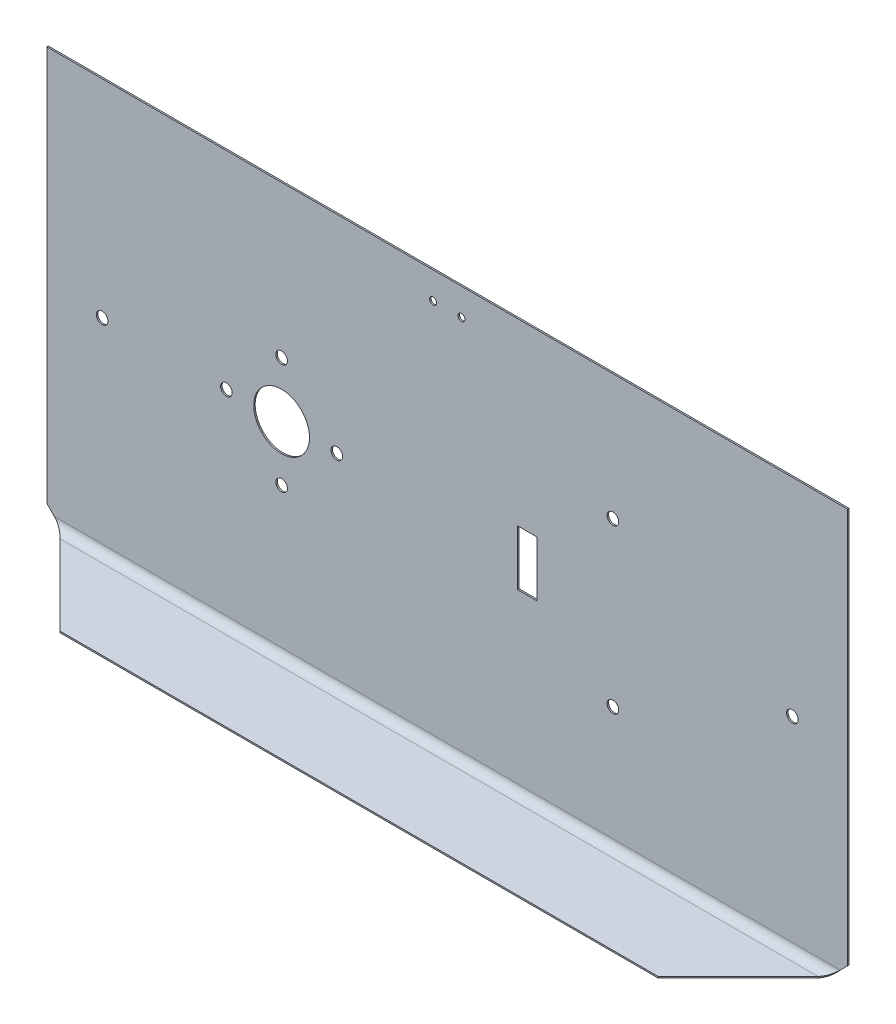
ISO-10303-21;
HEADER;
FILE_DESCRIPTION(('STEP AP214'),'2;1');
FILE_NAME('part.step','',(''),(''),'','','');
FILE_SCHEMA(('AUTOMOTIVE_DESIGN { 1 0 10303 214 1 1 1 1 }'));
ENDSEC;
DATA;
#1=APPLICATION_CONTEXT('core data for automotive mechanical design processes');
#2=APPLICATION_PROTOCOL_DEFINITION('international standard','automotive_design',2000,#1);
#3=PRODUCT_CONTEXT('',#1,'mechanical');
#4=PRODUCT('Part','Part','',(#3));
#5=PRODUCT_RELATED_PRODUCT_CATEGORY('part','',(#4));
#6=PRODUCT_DEFINITION_FORMATION('','',#4);
#7=PRODUCT_DEFINITION_CONTEXT('part definition',#1,'design');
#8=PRODUCT_DEFINITION('design','',#6,#7);
#9=PRODUCT_DEFINITION_SHAPE('','',#8);
#10=(LENGTH_UNIT() NAMED_UNIT(*) SI_UNIT(.MILLI.,.METRE.));
#11=(NAMED_UNIT(*) PLANE_ANGLE_UNIT() SI_UNIT($,.RADIAN.));
#12=(NAMED_UNIT(*) SI_UNIT($,.STERADIAN.) SOLID_ANGLE_UNIT());
#13=UNCERTAINTY_MEASURE_WITH_UNIT(LENGTH_MEASURE(1.E-05),#10,'distance_accuracy_value','');
#14=(GEOMETRIC_REPRESENTATION_CONTEXT(3) GLOBAL_UNCERTAINTY_ASSIGNED_CONTEXT((#13)) GLOBAL_UNIT_ASSIGNED_CONTEXT((#10,
#11,#12)) REPRESENTATION_CONTEXT('',''));
#15=CARTESIAN_POINT('',(0.,0.,0.));
#16=DIRECTION('',(0.,0.,1.));
#17=DIRECTION('',(1.,0.,0.));
#18=AXIS2_PLACEMENT_3D('',#15,#16,#17);
#19=CARTESIAN_POINT('',(145.,-58.9352822974256,-4.28615324153258));
#20=DIRECTION('',(0.707106781186539,0.,0.707106781186556));
#21=DIRECTION('',(0.707106781186556,0.,-0.707106781186539));
#22=AXIS2_PLACEMENT_3D('',#19,#20,#21);
#23=PLANE('',#22);
#24=DIRECTION('',(0.707106781186556,0.,-0.707106781186539));
#25=VECTOR('',#24,1.);
#26=CARTESIAN_POINT('',(145.,-59.4662822974256,-4.28615324153258));
#27=LINE('',#26,#25);
#28=CARTESIAN_POINT('',(108.247564461041,-59.4662822974255,32.4662822974255));
#29=VERTEX_POINT('',#28);
#30=CARTESIAN_POINT('',(137.182846758467,-59.4662822974256,3.53100000000001));
#31=VERTEX_POINT('',#30);
#32=EDGE_CURVE('E488',#29,#31,#27,.T.);
#33=ORIENTED_EDGE('',*,*,#32,.T.);
#34=CARTESIAN_POINT('',(137.182846758467,-58.9352822974256,3.53100000000001));
#35=CARTESIAN_POINT('',(137.182846758467,-59.4662822974256,3.53100000000001));
#36=B_SPLINE_CURVE_WITH_KNOTS('',1,(#34,#35),.UNSPECIFIED.,.F.,.F.,(2,2),(0.,1.),.UNSPECIFIED.);
#37=CARTESIAN_POINT('',(137.182846758467,-58.9352822974256,3.53100000000001));
#38=VERTEX_POINT('',#37);
#39=EDGE_CURVE('E501',#31,#38,#36,.F.);
#40=ORIENTED_EDGE('',*,*,#39,.T.);
#41=DIRECTION('',(0.707106781186556,0.,-0.707106781186539));
#42=VECTOR('',#41,1.);
#43=CARTESIAN_POINT('',(145.,-58.9352822974256,-4.28615324153258));
#44=LINE('',#43,#42);
#45=CARTESIAN_POINT('',(108.247564461041,-58.9352822974255,32.4662822974255));
#46=VERTEX_POINT('',#45);
#47=EDGE_CURVE('E482',#46,#38,#44,.T.);
#48=ORIENTED_EDGE('',*,*,#47,.F.);
#49=DIRECTION('',(0.,1.,0.));
#50=VECTOR('',#49,1.);
#51=CARTESIAN_POINT('',(108.247564461041,-58.9352822974255,32.4662822974255));
#52=LINE('',#51,#50);
#53=EDGE_CURVE('E490',#29,#46,#52,.T.);
#54=ORIENTED_EDGE('',*,*,#53,.F.);
#55=EDGE_LOOP('',(#33,#40,#48,#54));
#56=FACE_BOUND('',#55,.T.);
#57=ADVANCED_FACE('F66',(#56),#23,.T.);
#58=CARTESIAN_POINT('',(-145.,-58.9352822974256,-4.28615324153243));
#59=DIRECTION('',(-0.707106781186537,0.,0.707106781186558));
#60=DIRECTION('',(0.707106781186558,0.,0.707106781186537));
#61=AXIS2_PLACEMENT_3D('',#58,#59,#60);
#62=PLANE('',#61);
#63=DIRECTION('',(0.707106781186558,0.,0.707106781186537));
#64=VECTOR('',#63,1.);
#65=CARTESIAN_POINT('',(-145.,-58.9352822974256,-4.28615324153243));
#66=LINE('',#65,#64);
#67=CARTESIAN_POINT('',(-137.182846758467,-58.9352822974256,3.53100000000002));
#68=VERTEX_POINT('',#67);
#69=CARTESIAN_POINT('',(-108.247564461041,-58.9352822974255,32.4662822974256));
#70=VERTEX_POINT('',#69);
#71=EDGE_CURVE('E483',#68,#70,#66,.T.);
#72=ORIENTED_EDGE('',*,*,#71,.F.);
#73=CARTESIAN_POINT('',(-137.182846758467,-59.4662822974256,3.53100000000001));
#74=CARTESIAN_POINT('',(-137.182846758467,-58.9352822974256,3.53100000000001));
#75=B_SPLINE_CURVE_WITH_KNOTS('',1,(#73,#74),.UNSPECIFIED.,.F.,.F.,(2,2),(0.,1.),.UNSPECIFIED.);
#76=CARTESIAN_POINT('',(-137.182846758467,-59.4662822974256,3.53100000000001));
#77=VERTEX_POINT('',#76);
#78=EDGE_CURVE('E549',#68,#77,#75,.F.);
#79=ORIENTED_EDGE('',*,*,#78,.T.);
#80=DIRECTION('',(0.707106781186558,0.,0.707106781186537));
#81=VECTOR('',#80,1.);
#82=CARTESIAN_POINT('',(-145.,-59.4662822974256,-4.28615324153243));
#83=LINE('',#82,#81);
#84=CARTESIAN_POINT('',(-108.247564461041,-59.4662822974255,32.4662822974256));
#85=VERTEX_POINT('',#84);
#86=EDGE_CURVE('E489',#77,#85,#83,.T.);
#87=ORIENTED_EDGE('',*,*,#86,.T.);
#88=DIRECTION('',(0.,1.,0.));
#89=VECTOR('',#88,1.);
#90=CARTESIAN_POINT('',(-108.247564461041,-58.9352822974255,32.4662822974256));
#91=LINE('',#90,#89);
#92=EDGE_CURVE('E493',#85,#70,#91,.T.);
#93=ORIENTED_EDGE('',*,*,#92,.T.);
#94=EDGE_LOOP('',(#72,#79,#87,#93));
#95=FACE_BOUND('',#94,.T.);
#96=ADVANCED_FACE('F68',(#95),#62,.T.);
#97=CARTESIAN_POINT('',(0.,-58.9352822974258,-57.5337177025743));
#98=DIRECTION('',(0.,1.,0.));
#99=DIRECTION('',(1.,0.,0.));
#100=AXIS2_PLACEMENT_3D('',#97,#98,#99);
#101=PLANE('',#100);
#102=ORIENTED_EDGE('',*,*,#47,.T.);
#103=DIRECTION('',(-1.,0.,0.));
#104=VECTOR('',#103,1.);
#105=CARTESIAN_POINT('',(0.,-58.9352822974256,3.53100000000002));
#106=LINE('',#105,#104);
#107=EDGE_CURVE('E497',#38,#68,#106,.T.);
#108=ORIENTED_EDGE('',*,*,#107,.T.);
#109=ORIENTED_EDGE('',*,*,#71,.T.);
#110=DIRECTION('',(1.,0.,0.));
#111=VECTOR('',#110,1.);
#112=CARTESIAN_POINT('',(-108.247564461041,-58.9352822974255,32.4662822974256));
#113=LINE('',#112,#111);
#114=EDGE_CURVE('E478',#70,#46,#113,.T.);
#115=ORIENTED_EDGE('',*,*,#114,.T.);
#116=EDGE_LOOP('',(#102,#108,#109,#115));
#117=FACE_BOUND('',#116,.T.);
#118=ADVANCED_FACE('F530',(#117),#101,.T.);
#119=CARTESIAN_POINT('',(-108.247564461041,-58.9352822974255,32.4662822974256));
#120=DIRECTION('',(0.,0.,1.));
#121=DIRECTION('',(1.,0.,0.));
#122=AXIS2_PLACEMENT_3D('',#119,#120,#121);
#123=PLANE('',#122);
#124=ORIENTED_EDGE('',*,*,#92,.F.);
#125=DIRECTION('',(1.,0.,0.));
#126=VECTOR('',#125,1.);
#127=CARTESIAN_POINT('',(0.,-59.4662822974255,32.4662822974256));
#128=LINE('',#127,#126);
#129=EDGE_CURVE('E484',#85,#29,#128,.T.);
#130=ORIENTED_EDGE('',*,*,#129,.T.);
#131=ORIENTED_EDGE('',*,*,#53,.T.);
#132=ORIENTED_EDGE('',*,*,#114,.F.);
#133=EDGE_LOOP('',(#124,#130,#131,#132));
#134=FACE_BOUND('',#133,.T.);
#135=ADVANCED_FACE('F461',(#134),#123,.T.);
#136=CARTESIAN_POINT('',(0.,-59.4662822974258,-57.5337177025743));
#137=DIRECTION('',(0.,1.,0.));
#138=DIRECTION('',(1.,0.,0.));
#139=AXIS2_PLACEMENT_3D('',#136,#137,#138);
#140=PLANE('',#139);
#141=DIRECTION('',(-1.,0.,0.));
#142=VECTOR('',#141,1.);
#143=CARTESIAN_POINT('',(0.,-59.4662822974256,3.53100000000001));
#144=LINE('',#143,#142);
#145=EDGE_CURVE('E544',#31,#77,#144,.T.);
#146=ORIENTED_EDGE('',*,*,#145,.F.);
#147=ORIENTED_EDGE('',*,*,#32,.F.);
#148=ORIENTED_EDGE('',*,*,#129,.F.);
#149=ORIENTED_EDGE('',*,*,#86,.F.);
#150=EDGE_LOOP('',(#146,#147,#148,#149));
#151=FACE_BOUND('',#150,.T.);
#152=ADVANCED_FACE('F531',(#151),#140,.F.);
#153=CARTESIAN_POINT('',(-145.,90.,0.531));
#154=DIRECTION('',(-1.,0.,0.));
#155=DIRECTION('',(0.,-1.,0.));
#156=AXIS2_PLACEMENT_3D('',#153,#154,#155);
#157=PLANE('',#156);
#158=DIRECTION('',(0.,0.,1.));
#159=VECTOR('',#158,1.);
#160=CARTESIAN_POINT('',(-145.,90.,0.531));
#161=LINE('',#160,#159);
#162=CARTESIAN_POINT('',(-145.,90.,0.));
#163=VERTEX_POINT('',#162);
#164=CARTESIAN_POINT('',(-145.,90.,0.531));
#165=VERTEX_POINT('',#164);
#166=EDGE_CURVE('E408',#163,#165,#161,.T.);
#167=ORIENTED_EDGE('',*,*,#166,.F.);
#168=DIRECTION('',(0.,1.,0.));
#169=VECTOR('',#168,1.);
#170=CARTESIAN_POINT('',(-145.,0.,0.));
#171=LINE('',#170,#169);
#172=CARTESIAN_POINT('',(-145.,-53.2475644610419,0.));
#173=VERTEX_POINT('',#172);
#174=EDGE_CURVE('E418',#163,#173,#171,.F.);
#175=ORIENTED_EDGE('',*,*,#174,.T.);
#176=DIRECTION('',(0.,0.,1.));
#177=VECTOR('',#176,1.);
#178=CARTESIAN_POINT('',(-145.,-53.2475644610419,0.531));
#179=LINE('',#178,#177);
#180=CARTESIAN_POINT('',(-145.,-53.2475644610419,0.531));
#181=VERTEX_POINT('',#180);
#182=EDGE_CURVE('E415',#173,#181,#179,.T.);
#183=ORIENTED_EDGE('',*,*,#182,.T.);
#184=DIRECTION('',(0.,-1.,0.));
#185=VECTOR('',#184,1.);
#186=CARTESIAN_POINT('',(-145.,90.,0.531));
#187=LINE('',#186,#185);
#188=EDGE_CURVE('E387',#165,#181,#187,.T.);
#189=ORIENTED_EDGE('',*,*,#188,.F.);
#190=EDGE_LOOP('',(#167,#175,#183,#189));
#191=FACE_BOUND('',#190,.T.);
#192=ADVANCED_FACE('F346',(#191),#157,.T.);
#193=CARTESIAN_POINT('',(-145.,90.,0.531));
#194=DIRECTION('',(0.,1.,0.));
#195=DIRECTION('',(-1.,0.,0.));
#196=AXIS2_PLACEMENT_3D('',#193,#194,#195);
#197=PLANE('',#196);
#198=DIRECTION('',(0.,0.,1.));
#199=VECTOR('',#198,1.);
#200=CARTESIAN_POINT('',(145.,90.,0.531));
#201=LINE('',#200,#199);
#202=CARTESIAN_POINT('',(145.,90.,0.));
#203=VERTEX_POINT('',#202);
#204=CARTESIAN_POINT('',(145.,90.,0.531));
#205=VERTEX_POINT('',#204);
#206=EDGE_CURVE('E401',#203,#205,#201,.T.);
#207=ORIENTED_EDGE('',*,*,#206,.F.);
#208=DIRECTION('',(1.,0.,0.));
#209=VECTOR('',#208,1.);
#210=CARTESIAN_POINT('',(0.,90.,0.));
#211=LINE('',#210,#209);
#212=EDGE_CURVE('E411',#203,#163,#211,.F.);
#213=ORIENTED_EDGE('',*,*,#212,.T.);
#214=ORIENTED_EDGE('',*,*,#166,.T.);
#215=DIRECTION('',(-1.,0.,0.));
#216=VECTOR('',#215,1.);
#217=CARTESIAN_POINT('',(-145.,90.,0.531));
#218=LINE('',#217,#216);
#219=EDGE_CURVE('E392',#205,#165,#218,.T.);
#220=ORIENTED_EDGE('',*,*,#219,.F.);
#221=EDGE_LOOP('',(#207,#213,#214,#220));
#222=FACE_BOUND('',#221,.T.);
#223=ADVANCED_FACE('F538',(#222),#197,.T.);
#224=CARTESIAN_POINT('',(145.,90.,0.531));
#225=DIRECTION('',(1.,0.,0.));
#226=DIRECTION('',(0.,1.,0.));
#227=AXIS2_PLACEMENT_3D('',#224,#225,#226);
#228=PLANE('',#227);
#229=DIRECTION('',(0.,0.,1.));
#230=VECTOR('',#229,1.);
#231=CARTESIAN_POINT('',(145.,-53.2475644610417,0.531));
#232=LINE('',#231,#230);
#233=CARTESIAN_POINT('',(145.,-53.2475644610417,0.));
#234=VERTEX_POINT('',#233);
#235=CARTESIAN_POINT('',(145.,-53.2475644610417,0.531));
#236=VERTEX_POINT('',#235);
#237=EDGE_CURVE('E376',#234,#236,#232,.T.);
#238=ORIENTED_EDGE('',*,*,#237,.F.);
#239=DIRECTION('',(0.,1.,0.));
#240=VECTOR('',#239,1.);
#241=CARTESIAN_POINT('',(145.,0.,0.));
#242=LINE('',#241,#240);
#243=EDGE_CURVE('E404',#234,#203,#242,.T.);
#244=ORIENTED_EDGE('',*,*,#243,.T.);
#245=ORIENTED_EDGE('',*,*,#206,.T.);
#246=DIRECTION('',(0.,1.,0.));
#247=VECTOR('',#246,1.);
#248=CARTESIAN_POINT('',(145.,90.,0.531));
#249=LINE('',#248,#247);
#250=EDGE_CURVE('E396',#236,#205,#249,.T.);
#251=ORIENTED_EDGE('',*,*,#250,.F.);
#252=EDGE_LOOP('',(#238,#244,#245,#251));
#253=FACE_BOUND('',#252,.T.);
#254=ADVANCED_FACE('F741',(#253),#228,.T.);
#255=CARTESIAN_POINT('',(0.,0.,0.531));
#256=DIRECTION('',(0.,0.,1.));
#257=DIRECTION('',(1.,0.,0.));
#258=AXIS2_PLACEMENT_3D('',#255,#256,#257);
#259=PLANE('',#258);
#260=DIRECTION('',(0.,1.,0.));
#261=VECTOR('',#260,1.);
#262=CARTESIAN_POINT('',(32.5,25.,0.531));
#263=LINE('',#262,#261);
#264=CARTESIAN_POINT('',(32.5,4.99999999999998,0.531));
#265=VERTEX_POINT('',#264);
#266=CARTESIAN_POINT('',(32.5,25.,0.531));
#267=VERTEX_POINT('',#266);
#268=EDGE_CURVE('E83',#265,#267,#263,.T.);
#269=ORIENTED_EDGE('',*,*,#268,.F.);
#270=DIRECTION('',(1.,0.,0.));
#271=VECTOR('',#270,1.);
#272=CARTESIAN_POINT('',(25.5,4.99999999999998,0.531));
#273=LINE('',#272,#271);
#274=CARTESIAN_POINT('',(25.5,4.99999999999998,0.531));
#275=VERTEX_POINT('',#274);
#276=EDGE_CURVE('E190',#275,#265,#273,.T.);
#277=ORIENTED_EDGE('',*,*,#276,.F.);
#278=DIRECTION('',(0.,-1.,0.));
#279=VECTOR('',#278,1.);
#280=CARTESIAN_POINT('',(25.5,25.,0.531));
#281=LINE('',#280,#279);
#282=CARTESIAN_POINT('',(25.5,25.,0.531));
#283=VERTEX_POINT('',#282);
#284=EDGE_CURVE('E172',#283,#275,#281,.T.);
#285=ORIENTED_EDGE('',*,*,#284,.F.);
#286=DIRECTION('',(-1.,0.,0.));
#287=VECTOR('',#286,1.);
#288=CARTESIAN_POINT('',(25.5,25.,0.531));
#289=LINE('',#288,#287);
#290=EDGE_CURVE('E182',#267,#283,#289,.T.);
#291=ORIENTED_EDGE('',*,*,#290,.F.);
#292=EDGE_LOOP('',(#269,#277,#285,#291));
#293=FACE_BOUND('',#292,.T.);
#294=CARTESIAN_POINT('',(60.,-14.5,0.531));
#295=DIRECTION('',(0.,0.,1.));
#296=DIRECTION('',(1.,0.,0.));
#297=AXIS2_PLACEMENT_3D('',#294,#295,#296);
#298=CIRCLE('',#297,2.1);
#299=CARTESIAN_POINT('',(62.1,-14.5,0.531));
#300=VERTEX_POINT('',#299);
#301=EDGE_CURVE('E202',#300,#300,#298,.T.);
#302=ORIENTED_EDGE('',*,*,#301,.F.);
#303=EDGE_LOOP('',(#302));
#304=FACE_BOUND('',#303,.T.);
#305=CARTESIAN_POINT('',(60.,44.5,0.531));
#306=DIRECTION('',(0.,0.,1.));
#307=DIRECTION('',(1.,0.,0.));
#308=AXIS2_PLACEMENT_3D('',#305,#306,#307);
#309=CIRCLE('',#308,2.1);
#310=CARTESIAN_POINT('',(62.1,44.5,0.531));
#311=VERTEX_POINT('',#310);
#312=EDGE_CURVE('E216',#311,#311,#309,.T.);
#313=ORIENTED_EDGE('',*,*,#312,.F.);
#314=EDGE_LOOP('',(#313));
#315=FACE_BOUND('',#314,.T.);
#316=CARTESIAN_POINT('',(-40.,15.,0.531));
#317=DIRECTION('',(0.,0.,1.));
#318=DIRECTION('',(1.,0.,0.));
#319=AXIS2_PLACEMENT_3D('',#316,#317,#318);
#320=CIRCLE('',#319,2.1);
#321=CARTESIAN_POINT('',(-37.9,15.,0.531));
#322=VERTEX_POINT('',#321);
#323=EDGE_CURVE('E217',#322,#322,#320,.T.);
#324=ORIENTED_EDGE('',*,*,#323,.F.);
#325=EDGE_LOOP('',(#324));
#326=FACE_BOUND('',#325,.T.);
#327=CARTESIAN_POINT('',(-60.,35.,0.531));
#328=DIRECTION('',(0.,0.,1.));
#329=DIRECTION('',(1.,0.,0.));
#330=AXIS2_PLACEMENT_3D('',#327,#328,#329);
#331=CIRCLE('',#330,2.1);
#332=CARTESIAN_POINT('',(-57.9,35.,0.531));
#333=VERTEX_POINT('',#332);
#334=EDGE_CURVE('E211',#333,#333,#331,.T.);
#335=ORIENTED_EDGE('',*,*,#334,.F.);
#336=EDGE_LOOP('',(#335));
#337=FACE_BOUND('',#336,.T.);
#338=CARTESIAN_POINT('',(-80.,15.,0.531));
#339=DIRECTION('',(0.,0.,1.));
#340=DIRECTION('',(1.,0.,0.));
#341=AXIS2_PLACEMENT_3D('',#338,#339,#340);
#342=CIRCLE('',#341,2.09999999999999);
#343=CARTESIAN_POINT('',(-77.9,15.,0.531));
#344=VERTEX_POINT('',#343);
#345=EDGE_CURVE('E207',#344,#344,#342,.T.);
#346=ORIENTED_EDGE('',*,*,#345,.F.);
#347=EDGE_LOOP('',(#346));
#348=FACE_BOUND('',#347,.T.);
#349=CARTESIAN_POINT('',(-60.,-5.00000000000002,0.531));
#350=DIRECTION('',(0.,0.,1.));
#351=DIRECTION('',(1.,0.,0.));
#352=AXIS2_PLACEMENT_3D('',#349,#350,#351);
#353=CIRCLE('',#352,2.1);
#354=CARTESIAN_POINT('',(-57.9,-5.00000000000002,0.531));
#355=VERTEX_POINT('',#354);
#356=EDGE_CURVE('E212',#355,#355,#353,.T.);
#357=ORIENTED_EDGE('',*,*,#356,.F.);
#358=EDGE_LOOP('',(#357));
#359=FACE_BOUND('',#358,.T.);
#360=CARTESIAN_POINT('',(-60.,15.,0.531));
#361=DIRECTION('',(0.,0.,1.));
#362=DIRECTION('',(1.,0.,0.));
#363=AXIS2_PLACEMENT_3D('',#360,#361,#362);
#364=CIRCLE('',#363,10.1);
#365=CARTESIAN_POINT('',(-49.9,15.,0.531));
#366=VERTEX_POINT('',#365);
#367=EDGE_CURVE('E221',#366,#366,#364,.T.);
#368=ORIENTED_EDGE('',*,*,#367,.F.);
#369=EDGE_LOOP('',(#368));
#370=FACE_BOUND('',#369,.T.);
#371=CARTESIAN_POINT('',(5.15,80.2,0.531));
#372=DIRECTION('',(0.,0.,1.));
#373=DIRECTION('',(1.,0.,0.));
#374=AXIS2_PLACEMENT_3D('',#371,#372,#373);
#375=CIRCLE('',#374,1.25);
#376=CARTESIAN_POINT('',(6.4,80.2,0.531));
#377=VERTEX_POINT('',#376);
#378=EDGE_CURVE('E248',#377,#377,#375,.T.);
#379=ORIENTED_EDGE('',*,*,#378,.F.);
#380=EDGE_LOOP('',(#379));
#381=FACE_BOUND('',#380,.T.);
#382=CARTESIAN_POINT('',(-5.14999999999999,80.2,0.531));
#383=DIRECTION('',(0.,0.,1.));
#384=DIRECTION('',(1.,0.,0.));
#385=AXIS2_PLACEMENT_3D('',#382,#383,#384);
#386=CIRCLE('',#385,1.25);
#387=CARTESIAN_POINT('',(-3.89999999999999,80.2,0.531));
#388=VERTEX_POINT('',#387);
#389=EDGE_CURVE('E239',#388,#388,#386,.T.);
#390=ORIENTED_EDGE('',*,*,#389,.F.);
#391=EDGE_LOOP('',(#390));
#392=FACE_BOUND('',#391,.T.);
#393=CARTESIAN_POINT('',(125.,15.,0.531));
#394=DIRECTION('',(0.,0.,1.));
#395=DIRECTION('',(1.,0.,0.));
#396=AXIS2_PLACEMENT_3D('',#393,#394,#395);
#397=CIRCLE('',#396,2.1);
#398=CARTESIAN_POINT('',(127.1,15.,0.531));
#399=VERTEX_POINT('',#398);
#400=EDGE_CURVE('E263',#399,#399,#397,.T.);
#401=ORIENTED_EDGE('',*,*,#400,.F.);
#402=EDGE_LOOP('',(#401));
#403=FACE_BOUND('',#402,.T.);
#404=CARTESIAN_POINT('',(-125.,15.,0.531));
#405=DIRECTION('',(0.,0.,1.));
#406=DIRECTION('',(1.,0.,0.));
#407=AXIS2_PLACEMENT_3D('',#404,#405,#406);
#408=CIRCLE('',#407,2.1);
#409=CARTESIAN_POINT('',(-122.9,15.,0.531));
#410=VERTEX_POINT('',#409);
#411=EDGE_CURVE('E257',#410,#410,#408,.T.);
#412=ORIENTED_EDGE('',*,*,#411,.F.);
#413=EDGE_LOOP('',(#412));
#414=FACE_BOUND('',#413,.T.);
#415=DIRECTION('',(-1.,0.,0.));
#416=VECTOR('',#415,1.);
#417=CARTESIAN_POINT('',(0.,-55.9352822974256,0.531));
#418=LINE('',#417,#416);
#419=CARTESIAN_POINT('',(142.312282163616,-55.9352822974256,0.531));
#420=VERTEX_POINT('',#419);
#421=CARTESIAN_POINT('',(-142.312282163616,-55.9352822974256,0.531));
#422=VERTEX_POINT('',#421);
#423=EDGE_CURVE('E427',#420,#422,#418,.T.);
#424=ORIENTED_EDGE('',*,*,#423,.F.);
#425=DIRECTION('',(0.707106781186556,0.707106781186539,0.));
#426=VECTOR('',#425,1.);
#427=CARTESIAN_POINT('',(145.,-53.2475644610417,0.531));
#428=LINE('',#427,#426);
#429=EDGE_CURVE('E400',#420,#236,#428,.T.);
#430=ORIENTED_EDGE('',*,*,#429,.T.);
#431=ORIENTED_EDGE('',*,*,#250,.T.);
#432=ORIENTED_EDGE('',*,*,#219,.T.);
#433=ORIENTED_EDGE('',*,*,#188,.T.);
#434=DIRECTION('',(0.707106781186558,-0.707106781186537,0.));
#435=VECTOR('',#434,1.);
#436=CARTESIAN_POINT('',(-145.,-53.2475644610419,0.531));
#437=LINE('',#436,#435);
#438=EDGE_CURVE('E391',#181,#422,#437,.T.);
#439=ORIENTED_EDGE('',*,*,#438,.T.);
#440=EDGE_LOOP('',(#424,#430,#431,#432,#433,#439));
#441=FACE_BOUND('',#440,.T.);
#442=ADVANCED_FACE('F187',(#293,#304,#315,#326,#337,#348,#359,#370,#381,#392,#403,#414,#441),
#259,.T.);
#443=CARTESIAN_POINT('',(145.,-53.2475644610417,0.531));
#444=DIRECTION('',(0.707106781186539,-0.707106781186556,0.));
#445=DIRECTION('',(0.707106781186556,0.707106781186539,0.));
#446=AXIS2_PLACEMENT_3D('',#443,#444,#445);
#447=PLANE('',#446);
#448=CARTESIAN_POINT('',(142.312282163616,-55.9352822974256,0.));
#449=CARTESIAN_POINT('',(142.312282163616,-55.9352822974256,0.531));
#450=B_SPLINE_CURVE_WITH_KNOTS('',1,(#448,#449),.UNSPECIFIED.,.F.,.F.,(2,2),(0.,1.),.UNSPECIFIED.);
#451=CARTESIAN_POINT('',(142.312282163616,-55.9352822974256,0.));
#452=VERTEX_POINT('',#451);
#453=EDGE_CURVE('E422',#452,#420,#450,.T.);
#454=ORIENTED_EDGE('',*,*,#453,.F.);
#455=DIRECTION('',(0.707106781186556,0.707106781186539,0.));
#456=VECTOR('',#455,1.);
#457=CARTESIAN_POINT('',(145.,-53.2475644610417,0.));
#458=LINE('',#457,#456);
#459=EDGE_CURVE('E386',#452,#234,#458,.T.);
#460=ORIENTED_EDGE('',*,*,#459,.T.);
#461=ORIENTED_EDGE('',*,*,#237,.T.);
#462=ORIENTED_EDGE('',*,*,#429,.F.);
#463=EDGE_LOOP('',(#454,#460,#461,#462));
#464=FACE_BOUND('',#463,.T.);
#465=ADVANCED_FACE('F441',(#464),#447,.T.);
#466=CARTESIAN_POINT('',(0.,0.,0.));
#467=DIRECTION('',(0.,0.,1.));
#468=DIRECTION('',(1.,0.,0.));
#469=AXIS2_PLACEMENT_3D('',#466,#467,#468);
#470=PLANE('',#469);
#471=DIRECTION('',(1.,0.,0.));
#472=VECTOR('',#471,1.);
#473=CARTESIAN_POINT('',(0.,4.99999999999998,0.));
#474=LINE('',#473,#472);
#475=CARTESIAN_POINT('',(25.5,4.99999999999998,0.));
#476=VERTEX_POINT('',#475);
#477=CARTESIAN_POINT('',(32.5,4.99999999999998,0.));
#478=VERTEX_POINT('',#477);
#479=EDGE_CURVE('E76',#476,#478,#474,.T.);
#480=ORIENTED_EDGE('',*,*,#479,.T.);
#481=DIRECTION('',(0.,1.,0.));
#482=VECTOR('',#481,1.);
#483=CARTESIAN_POINT('',(32.5,0.,0.));
#484=LINE('',#483,#482);
#485=CARTESIAN_POINT('',(32.5,25.,0.));
#486=VERTEX_POINT('',#485);
#487=EDGE_CURVE('E12',#478,#486,#484,.T.);
#488=ORIENTED_EDGE('',*,*,#487,.T.);
#489=DIRECTION('',(-1.,0.,0.));
#490=VECTOR('',#489,1.);
#491=CARTESIAN_POINT('',(0.,25.,0.));
#492=LINE('',#491,#490);
#493=CARTESIAN_POINT('',(25.5,25.,0.));
#494=VERTEX_POINT('',#493);
#495=EDGE_CURVE('E552',#486,#494,#492,.T.);
#496=ORIENTED_EDGE('',*,*,#495,.T.);
#497=DIRECTION('',(0.,-1.,0.));
#498=VECTOR('',#497,1.);
#499=CARTESIAN_POINT('',(25.5,0.,0.));
#500=LINE('',#499,#498);
#501=EDGE_CURVE('E175',#494,#476,#500,.T.);
#502=ORIENTED_EDGE('',*,*,#501,.T.);
#503=EDGE_LOOP('',(#480,#488,#496,#502));
#504=FACE_BOUND('',#503,.T.);
#505=CARTESIAN_POINT('',(60.,-14.5,0.));
#506=DIRECTION('',(0.,0.,1.));
#507=DIRECTION('',(1.,0.,0.));
#508=AXIS2_PLACEMENT_3D('',#505,#506,#507);
#509=CIRCLE('',#508,2.1);
#510=CARTESIAN_POINT('',(62.1,-14.5,0.));
#511=VERTEX_POINT('',#510);
#512=EDGE_CURVE('E244',#511,#511,#509,.T.);
#513=ORIENTED_EDGE('',*,*,#512,.T.);
#514=EDGE_LOOP('',(#513));
#515=FACE_BOUND('',#514,.T.);
#516=CARTESIAN_POINT('',(60.,44.5,0.));
#517=DIRECTION('',(0.,0.,1.));
#518=DIRECTION('',(1.,0.,0.));
#519=AXIS2_PLACEMENT_3D('',#516,#517,#518);
#520=CIRCLE('',#519,2.1);
#521=CARTESIAN_POINT('',(62.1,44.5,0.));
#522=VERTEX_POINT('',#521);
#523=EDGE_CURVE('E593',#522,#522,#520,.T.);
#524=ORIENTED_EDGE('',*,*,#523,.T.);
#525=EDGE_LOOP('',(#524));
#526=FACE_BOUND('',#525,.T.);
#527=CARTESIAN_POINT('',(-40.,15.,0.));
#528=DIRECTION('',(0.,0.,1.));
#529=DIRECTION('',(1.,0.,0.));
#530=AXIS2_PLACEMENT_3D('',#527,#528,#529);
#531=CIRCLE('',#530,2.1);
#532=CARTESIAN_POINT('',(-37.9,15.,0.));
#533=VERTEX_POINT('',#532);
#534=EDGE_CURVE('E589',#533,#533,#531,.T.);
#535=ORIENTED_EDGE('',*,*,#534,.T.);
#536=EDGE_LOOP('',(#535));
#537=FACE_BOUND('',#536,.T.);
#538=CARTESIAN_POINT('',(-60.,35.,0.));
#539=DIRECTION('',(0.,0.,1.));
#540=DIRECTION('',(1.,0.,0.));
#541=AXIS2_PLACEMENT_3D('',#538,#539,#540);
#542=CIRCLE('',#541,2.1);
#543=CARTESIAN_POINT('',(-57.9,35.,0.));
#544=VERTEX_POINT('',#543);
#545=EDGE_CURVE('E585',#544,#544,#542,.T.);
#546=ORIENTED_EDGE('',*,*,#545,.T.);
#547=EDGE_LOOP('',(#546));
#548=FACE_BOUND('',#547,.T.);
#549=CARTESIAN_POINT('',(-80.,15.,0.));
#550=DIRECTION('',(0.,0.,1.));
#551=DIRECTION('',(1.,0.,0.));
#552=AXIS2_PLACEMENT_3D('',#549,#550,#551);
#553=CIRCLE('',#552,2.09999999999999);
#554=CARTESIAN_POINT('',(-77.9,15.,0.));
#555=VERTEX_POINT('',#554);
#556=EDGE_CURVE('E581',#555,#555,#553,.T.);
#557=ORIENTED_EDGE('',*,*,#556,.T.);
#558=EDGE_LOOP('',(#557));
#559=FACE_BOUND('',#558,.T.);
#560=CARTESIAN_POINT('',(-60.,-5.00000000000002,0.));
#561=DIRECTION('',(0.,0.,1.));
#562=DIRECTION('',(1.,0.,0.));
#563=AXIS2_PLACEMENT_3D('',#560,#561,#562);
#564=CIRCLE('',#563,2.1);
#565=CARTESIAN_POINT('',(-57.9,-5.00000000000002,0.));
#566=VERTEX_POINT('',#565);
#567=EDGE_CURVE('E577',#566,#566,#564,.T.);
#568=ORIENTED_EDGE('',*,*,#567,.T.);
#569=EDGE_LOOP('',(#568));
#570=FACE_BOUND('',#569,.T.);
#571=CARTESIAN_POINT('',(-60.,15.,0.));
#572=DIRECTION('',(0.,0.,1.));
#573=DIRECTION('',(1.,0.,0.));
#574=AXIS2_PLACEMENT_3D('',#571,#572,#573);
#575=CIRCLE('',#574,10.1);
#576=CARTESIAN_POINT('',(-49.9,15.,0.));
#577=VERTEX_POINT('',#576);
#578=EDGE_CURVE('E234',#577,#577,#575,.T.);
#579=ORIENTED_EDGE('',*,*,#578,.T.);
#580=EDGE_LOOP('',(#579));
#581=FACE_BOUND('',#580,.T.);
#582=CARTESIAN_POINT('',(5.15,80.2,0.));
#583=DIRECTION('',(0.,0.,-1.));
#584=DIRECTION('',(-1.,0.,0.));
#585=AXIS2_PLACEMENT_3D('',#582,#583,#584);
#586=CIRCLE('',#585,1.25);
#587=CARTESIAN_POINT('',(3.9,80.2,0.));
#588=VERTEX_POINT('',#587);
#589=EDGE_CURVE('E235',#588,#588,#586,.T.);
#590=ORIENTED_EDGE('',*,*,#589,.F.);
#591=EDGE_LOOP('',(#590));
#592=FACE_BOUND('',#591,.T.);
#593=CARTESIAN_POINT('',(-5.14999999999999,80.2,0.));
#594=DIRECTION('',(0.,0.,-1.));
#595=DIRECTION('',(-1.,0.,0.));
#596=AXIS2_PLACEMENT_3D('',#593,#594,#595);
#597=CIRCLE('',#596,1.25);
#598=CARTESIAN_POINT('',(-6.39999999999999,80.2,0.));
#599=VERTEX_POINT('',#598);
#600=EDGE_CURVE('E240',#599,#599,#597,.T.);
#601=ORIENTED_EDGE('',*,*,#600,.F.);
#602=EDGE_LOOP('',(#601));
#603=FACE_BOUND('',#602,.T.);
#604=CARTESIAN_POINT('',(125.,15.,0.));
#605=DIRECTION('',(0.,0.,-1.));
#606=DIRECTION('',(-1.,0.,0.));
#607=AXIS2_PLACEMENT_3D('',#604,#605,#606);
#608=CIRCLE('',#607,2.1);
#609=CARTESIAN_POINT('',(122.9,15.,0.));
#610=VERTEX_POINT('',#609);
#611=EDGE_CURVE('E253',#610,#610,#608,.T.);
#612=ORIENTED_EDGE('',*,*,#611,.F.);
#613=EDGE_LOOP('',(#612));
#614=FACE_BOUND('',#613,.T.);
#615=CARTESIAN_POINT('',(-125.,15.,0.));
#616=DIRECTION('',(0.,0.,-1.));
#617=DIRECTION('',(1.,0.,0.));
#618=AXIS2_PLACEMENT_3D('',#615,#616,#617);
#619=CIRCLE('',#618,2.1);
#620=CARTESIAN_POINT('',(-122.9,15.,0.));
#621=VERTEX_POINT('',#620);
#622=EDGE_CURVE('E252',#621,#621,#619,.T.);
#623=ORIENTED_EDGE('',*,*,#622,.F.);
#624=EDGE_LOOP('',(#623));
#625=FACE_BOUND('',#624,.T.);
#626=ORIENTED_EDGE('',*,*,#459,.F.);
#627=DIRECTION('',(-1.,0.,0.));
#628=VECTOR('',#627,1.);
#629=CARTESIAN_POINT('',(0.,-55.9352822974256,0.));
#630=LINE('',#629,#628);
#631=CARTESIAN_POINT('',(-142.312282163616,-55.9352822974256,0.));
#632=VERTEX_POINT('',#631);
#633=EDGE_CURVE('E385',#452,#632,#630,.T.);
#634=ORIENTED_EDGE('',*,*,#633,.T.);
#635=DIRECTION('',(0.707106781186558,-0.707106781186537,0.));
#636=VECTOR('',#635,1.);
#637=CARTESIAN_POINT('',(-145.,-53.2475644610419,0.));
#638=LINE('',#637,#636);
#639=EDGE_CURVE('E560',#173,#632,#638,.T.);
#640=ORIENTED_EDGE('',*,*,#639,.F.);
#641=ORIENTED_EDGE('',*,*,#174,.F.);
#642=ORIENTED_EDGE('',*,*,#212,.F.);
#643=ORIENTED_EDGE('',*,*,#243,.F.);
#644=EDGE_LOOP('',(#626,#634,#640,#641,#642,#643));
#645=FACE_BOUND('',#644,.T.);
#646=ADVANCED_FACE('F451',(#504,#515,#526,#537,#548,#559,#570,#581,#592,#603,#614,#625,#645),
#470,.F.);
#647=CARTESIAN_POINT('',(-145.,-53.2475644610419,0.531));
#648=DIRECTION('',(-0.707106781186537,-0.707106781186558,0.));
#649=DIRECTION('',(0.707106781186558,-0.707106781186537,0.));
#650=AXIS2_PLACEMENT_3D('',#647,#648,#649);
#651=PLANE('',#650);
#652=CARTESIAN_POINT('',(-142.312282163616,-55.9352822974256,0.531));
#653=CARTESIAN_POINT('',(-142.312282163616,-55.9352822974256,0.));
#654=B_SPLINE_CURVE_WITH_KNOTS('',1,(#652,#653),.UNSPECIFIED.,.F.,.F.,(2,2),(0.,1.),.UNSPECIFIED.);
#655=EDGE_CURVE('E372',#422,#632,#654,.T.);
#656=ORIENTED_EDGE('',*,*,#655,.F.);
#657=ORIENTED_EDGE('',*,*,#438,.F.);
#658=ORIENTED_EDGE('',*,*,#182,.F.);
#659=ORIENTED_EDGE('',*,*,#639,.T.);
#660=EDGE_LOOP('',(#656,#657,#658,#659));
#661=FACE_BOUND('',#660,.T.);
#662=ADVANCED_FACE('F455',(#661),#651,.T.);
#663=CARTESIAN_POINT('',(137.182846758467,-59.4662822974256,3.53100000000001));
#664=CARTESIAN_POINT('',(137.610341249236,-59.4662822974256,3.06874826308267));
#665=CARTESIAN_POINT('',(138.037752659325,-59.3743798187414,2.60676822032739));
#666=CARTESIAN_POINT('',(138.892658560184,-59.0206220347045,1.75272138031036));
#667=CARTESIAN_POINT('',(139.320111510613,-58.7589059179336,1.36103553176858));
#668=CARTESIAN_POINT('',(140.175017411471,-58.105246765657,0.707376379492029));
#669=CARTESIAN_POINT('',(140.6024703619,-57.7135609171152,0.445660262721117));
#670=CARTESIAN_POINT('',(141.457376262758,-56.8595140770982,0.0919024786841782));
#671=CARTESIAN_POINT('',(141.884787672848,-56.3975340343429,0.));
#672=CARTESIAN_POINT('',(142.312282163616,-55.9352822974256,0.));
#673=CARTESIAN_POINT('',(137.182846758467,-58.9352822974256,3.53100000000001));
#674=CARTESIAN_POINT('',(137.610334983276,-58.9352822974256,3.13826851188882));
#675=CARTESIAN_POINT('',(138.037752659325,-58.8572003274305,2.74575634692216));
#676=CARTESIAN_POINT('',(138.892658560184,-58.5566414624884,2.02014305888731));
#677=CARTESIAN_POINT('',(139.320111510613,-58.3342828246201,1.68735984007526));
#678=CARTESIAN_POINT('',(140.175017411471,-57.7789224573503,1.13199947280546));
#679=CARTESIAN_POINT('',(140.6024703619,-57.4461392385383,0.909640834937228));
#680=CARTESIAN_POINT('',(141.457376262758,-56.7205259505034,0.609081969995054));
#681=CARTESIAN_POINT('',(141.884793938807,-56.3280137855368,0.531000000000001));
#682=CARTESIAN_POINT('',(142.312282163616,-55.9352822974256,0.531));
#683=B_SPLINE_SURFACE_WITH_KNOTS('',1,3,((#663,#664,#665,#666,#667,#668,#669,#670,#671,#672),
(#673,#674,#675,#676,#677,#678,#679,#680,#681,#682)),.UNSPECIFIED.,.F.,.F.,.F.,(2,2),(4,2,2,2,
4),(0.,1.),(0.,0.25,0.5,0.75,1.),.UNSPECIFIED.);
#684=CARTESIAN_POINT('',(137.182846758467,-59.4662822974256,3.53100000000001));
#685=CARTESIAN_POINT('',(137.610341249236,-59.4662822974256,3.06874826308267));
#686=CARTESIAN_POINT('',(138.037752659325,-59.3743798187414,2.60676822032739));
#687=CARTESIAN_POINT('',(138.892658560184,-59.0206220347045,1.75272138031036));
#688=CARTESIAN_POINT('',(139.320111510613,-58.7589059179336,1.36103553176858));
#689=CARTESIAN_POINT('',(140.175017411471,-58.105246765657,0.707376379492029));
#690=CARTESIAN_POINT('',(140.6024703619,-57.7135609171152,0.445660262721117));
#691=CARTESIAN_POINT('',(141.457376262758,-56.8595140770982,0.0919024786841782));
#692=CARTESIAN_POINT('',(141.884787672848,-56.3975340343429,0.));
#693=CARTESIAN_POINT('',(142.312282163616,-55.9352822974256,0.));
#694=B_SPLINE_CURVE_WITH_KNOTS('',3,(#684,#685,#686,#687,#688,#689,#690,#691,#692,#693),
.UNSPECIFIED.,.F.,.F.,(4,2,2,2,4),(0.,0.25,0.5,0.75,1.),.UNSPECIFIED.);
#695=EDGE_CURVE('E267',#31,#452,#694,.T.);
#696=CARTESIAN_POINT('',(142.312282163616,-55.9352822974256,0.531));
#697=CARTESIAN_POINT('',(141.884793938807,-56.3280137855368,0.531000000000001));
#698=CARTESIAN_POINT('',(141.457376262758,-56.7205259505034,0.609081969995054));
#699=CARTESIAN_POINT('',(140.6024703619,-57.4461392385383,0.909640834937228));
#700=CARTESIAN_POINT('',(140.175017411471,-57.7789224573503,1.13199947280546));
#701=CARTESIAN_POINT('',(139.320111510613,-58.3342828246201,1.68735984007526));
#702=CARTESIAN_POINT('',(138.892658560184,-58.5566414624884,2.02014305888731));
#703=CARTESIAN_POINT('',(138.037752659325,-58.8572003274305,2.74575634692216));
#704=CARTESIAN_POINT('',(137.610334983276,-58.9352822974256,3.13826851188882));
#705=CARTESIAN_POINT('',(137.182846758467,-58.9352822974256,3.53100000000001));
#706=B_SPLINE_CURVE_WITH_KNOTS('',3,(#696,#697,#698,#699,#700,#701,#702,#703,#704,#705),
.UNSPECIFIED.,.F.,.F.,(4,2,2,2,4),(0.,0.25,0.5,0.75,1.),.UNSPECIFIED.);
#707=EDGE_CURVE('E686',#38,#420,#706,.F.);
#708=ORIENTED_EDGE('',*,*,#39,.F.);
#709=ORIENTED_EDGE('',*,*,#695,.T.);
#710=ORIENTED_EDGE('',*,*,#453,.T.);
#711=ORIENTED_EDGE('',*,*,#707,.F.);
#712=EDGE_LOOP('',(#708,#709,#710,#711));
#713=FACE_BOUND('',#712,.T.);
#714=ADVANCED_FACE('F342',(#713),#683,.F.);
#715=CARTESIAN_POINT('',(-142.312282163616,-55.9352822974256,0.));
#716=CARTESIAN_POINT('',(-141.884787672848,-56.3975340343429,0.));
#717=CARTESIAN_POINT('',(-141.457376262758,-56.8595140770982,0.0919024786841787));
#718=CARTESIAN_POINT('',(-140.6024703619,-57.7135609171152,0.445660262721119));
#719=CARTESIAN_POINT('',(-140.175017411471,-58.105246765657,0.707376379492031));
#720=CARTESIAN_POINT('',(-139.320111510613,-58.7589059179336,1.36103553176858));
#721=CARTESIAN_POINT('',(-138.892658560184,-59.0206220347045,1.75272138031036));
#722=CARTESIAN_POINT('',(-138.037752659325,-59.3743798187414,2.60676822032739));
#723=CARTESIAN_POINT('',(-137.610341249236,-59.4662822974256,3.06874826308268));
#724=CARTESIAN_POINT('',(-137.182846758467,-59.4662822974256,3.53100000000001));
#725=CARTESIAN_POINT('',(-142.312282163616,-55.9352822974256,0.531));
#726=CARTESIAN_POINT('',(-141.884793938807,-56.3280137855368,0.531000000000001));
#727=CARTESIAN_POINT('',(-141.457376262758,-56.7205259505034,0.609081969995054));
#728=CARTESIAN_POINT('',(-140.6024703619,-57.4461392385383,0.909640834937229));
#729=CARTESIAN_POINT('',(-140.175017411471,-57.7789224573503,1.13199947280546));
#730=CARTESIAN_POINT('',(-139.320111510613,-58.3342828246201,1.68735984007526));
#731=CARTESIAN_POINT('',(-138.892658560184,-58.5566414624884,2.02014305888731));
#732=CARTESIAN_POINT('',(-138.037752659325,-58.8572003274305,2.74575634692217));
#733=CARTESIAN_POINT('',(-137.610334983276,-58.9352822974256,3.13826851188878));
#734=CARTESIAN_POINT('',(-137.182846758467,-58.9352822974256,3.53100000000001));
#735=B_SPLINE_SURFACE_WITH_KNOTS('',1,3,((#715,#716,#717,#718,#719,#720,#721,#722,#723,#724),
(#725,#726,#727,#728,#729,#730,#731,#732,#733,#734)),.UNSPECIFIED.,.F.,.F.,.F.,(2,2),(4,2,2,2,
4),(0.,1.),(0.,0.25,0.5,0.75,1.),.UNSPECIFIED.);
#736=CARTESIAN_POINT('',(-142.312282163616,-55.9352822974256,0.));
#737=CARTESIAN_POINT('',(-141.884787672848,-56.3975340343429,0.));
#738=CARTESIAN_POINT('',(-141.457376262758,-56.8595140770982,0.0919024786841787));
#739=CARTESIAN_POINT('',(-140.6024703619,-57.7135609171152,0.445660262721119));
#740=CARTESIAN_POINT('',(-140.175017411471,-58.105246765657,0.707376379492031));
#741=CARTESIAN_POINT('',(-139.320111510613,-58.7589059179336,1.36103553176858));
#742=CARTESIAN_POINT('',(-138.892658560184,-59.0206220347045,1.75272138031036));
#743=CARTESIAN_POINT('',(-138.037752659325,-59.3743798187414,2.60676822032739));
#744=CARTESIAN_POINT('',(-137.610341249236,-59.4662822974256,3.06874826308268));
#745=CARTESIAN_POINT('',(-137.182846758467,-59.4662822974256,3.53100000000001));
#746=B_SPLINE_CURVE_WITH_KNOTS('',3,(#736,#737,#738,#739,#740,#741,#742,#743,#744,#745),
.UNSPECIFIED.,.F.,.F.,(4,2,2,2,4),(0.,0.25,0.5,0.75,1.),.UNSPECIFIED.);
#747=EDGE_CURVE('E315',#632,#77,#746,.T.);
#748=CARTESIAN_POINT('',(-137.182846758467,-58.9352822974256,3.53100000000001));
#749=CARTESIAN_POINT('',(-137.610334983276,-58.9352822974256,3.13826851188878));
#750=CARTESIAN_POINT('',(-138.037752659325,-58.8572003274305,2.74575634692217));
#751=CARTESIAN_POINT('',(-138.892658560184,-58.5566414624884,2.02014305888731));
#752=CARTESIAN_POINT('',(-139.320111510613,-58.3342828246201,1.68735984007526));
#753=CARTESIAN_POINT('',(-140.175017411471,-57.7789224573503,1.13199947280546));
#754=CARTESIAN_POINT('',(-140.6024703619,-57.4461392385383,0.909640834937229));
#755=CARTESIAN_POINT('',(-141.457376262758,-56.7205259505034,0.609081969995054));
#756=CARTESIAN_POINT('',(-141.884793938807,-56.3280137855368,0.531000000000001));
#757=CARTESIAN_POINT('',(-142.312282163616,-55.9352822974256,0.531));
#758=B_SPLINE_CURVE_WITH_KNOTS('',3,(#748,#749,#750,#751,#752,#753,#754,#755,#756,#757),
.UNSPECIFIED.,.F.,.F.,(4,2,2,2,4),(0.,0.25,0.5,0.75,1.),.UNSPECIFIED.);
#759=EDGE_CURVE('E308',#422,#68,#758,.F.);
#760=ORIENTED_EDGE('',*,*,#747,.T.);
#761=ORIENTED_EDGE('',*,*,#78,.F.);
#762=ORIENTED_EDGE('',*,*,#759,.F.);
#763=ORIENTED_EDGE('',*,*,#655,.T.);
#764=EDGE_LOOP('',(#760,#761,#762,#763));
#765=FACE_BOUND('',#764,.T.);
#766=ADVANCED_FACE('F285',(#765),#735,.F.);
#767=CARTESIAN_POINT('',(-284.671276540227,-55.9352822974256,3.531));
#768=DIRECTION('',(1.,0.,0.));
#769=DIRECTION('',(0.,1.,0.));
#770=AXIS2_PLACEMENT_3D('',#767,#768,#769);
#771=CYLINDRICAL_SURFACE('',#770,3.);
#772=ORIENTED_EDGE('',*,*,#423,.T.);
#773=ORIENTED_EDGE('',*,*,#759,.T.);
#774=ORIENTED_EDGE('',*,*,#107,.F.);
#775=ORIENTED_EDGE('',*,*,#707,.T.);
#776=EDGE_LOOP('',(#772,#773,#774,#775));
#777=FACE_BOUND('',#776,.T.);
#778=ADVANCED_FACE('F274',(#777),#771,.F.);
#779=CARTESIAN_POINT('',(-284.671276540227,-55.9352822974256,3.531));
#780=DIRECTION('',(1.,0.,0.));
#781=DIRECTION('',(0.,1.,0.));
#782=AXIS2_PLACEMENT_3D('',#779,#780,#781);
#783=CYLINDRICAL_SURFACE('',#782,3.531);
#784=ORIENTED_EDGE('',*,*,#633,.F.);
#785=ORIENTED_EDGE('',*,*,#695,.F.);
#786=ORIENTED_EDGE('',*,*,#145,.T.);
#787=ORIENTED_EDGE('',*,*,#747,.F.);
#788=EDGE_LOOP('',(#784,#785,#786,#787));
#789=FACE_BOUND('',#788,.T.);
#790=ADVANCED_FACE('F284',(#789),#783,.T.);
#791=CARTESIAN_POINT('',(-125.,15.,10.));
#792=DIRECTION('',(0.,0.,-1.));
#793=DIRECTION('',(-1.,0.,0.));
#794=AXIS2_PLACEMENT_3D('',#791,#792,#793);
#795=CYLINDRICAL_SURFACE('',#794,2.1);
#796=ORIENTED_EDGE('',*,*,#411,.T.);
#797=EDGE_LOOP('',(#796));
#798=FACE_BOUND('',#797,.T.);
#799=ORIENTED_EDGE('',*,*,#622,.T.);
#800=EDGE_LOOP('',(#799));
#801=FACE_BOUND('',#800,.T.);
#802=ADVANCED_FACE('F287',(#798,#801),#795,.F.);
#803=CARTESIAN_POINT('',(125.,15.,10.));
#804=DIRECTION('',(0.,0.,-1.));
#805=DIRECTION('',(-1.,0.,0.));
#806=AXIS2_PLACEMENT_3D('',#803,#804,#805);
#807=CYLINDRICAL_SURFACE('',#806,2.1);
#808=ORIENTED_EDGE('',*,*,#400,.T.);
#809=EDGE_LOOP('',(#808));
#810=FACE_BOUND('',#809,.T.);
#811=ORIENTED_EDGE('',*,*,#611,.T.);
#812=EDGE_LOOP('',(#811));
#813=FACE_BOUND('',#812,.T.);
#814=ADVANCED_FACE('F654',(#810,#813),#807,.F.);
#815=CARTESIAN_POINT('',(-5.14999999999999,80.2,10.));
#816=DIRECTION('',(0.,0.,-1.));
#817=DIRECTION('',(-1.,0.,0.));
#818=AXIS2_PLACEMENT_3D('',#815,#816,#817);
#819=CYLINDRICAL_SURFACE('',#818,1.25);
#820=ORIENTED_EDGE('',*,*,#389,.T.);
#821=EDGE_LOOP('',(#820));
#822=FACE_BOUND('',#821,.T.);
#823=ORIENTED_EDGE('',*,*,#600,.T.);
#824=EDGE_LOOP('',(#823));
#825=FACE_BOUND('',#824,.T.);
#826=ADVANCED_FACE('F651',(#822,#825),#819,.F.);
#827=CARTESIAN_POINT('',(5.15,80.2,10.));
#828=DIRECTION('',(0.,0.,-1.));
#829=DIRECTION('',(-1.,0.,0.));
#830=AXIS2_PLACEMENT_3D('',#827,#828,#829);
#831=CYLINDRICAL_SURFACE('',#830,1.25);
#832=ORIENTED_EDGE('',*,*,#378,.T.);
#833=EDGE_LOOP('',(#832));
#834=FACE_BOUND('',#833,.T.);
#835=ORIENTED_EDGE('',*,*,#589,.T.);
#836=EDGE_LOOP('',(#835));
#837=FACE_BOUND('',#836,.T.);
#838=ADVANCED_FACE('F647',(#834,#837),#831,.F.);
#839=CARTESIAN_POINT('',(-60.,15.,-9.469));
#840=DIRECTION('',(0.,0.,1.));
#841=DIRECTION('',(1.,0.,0.));
#842=AXIS2_PLACEMENT_3D('',#839,#840,#841);
#843=CYLINDRICAL_SURFACE('',#842,10.1);
#844=ORIENTED_EDGE('',*,*,#367,.T.);
#845=EDGE_LOOP('',(#844));
#846=FACE_BOUND('',#845,.T.);
#847=ORIENTED_EDGE('',*,*,#578,.F.);
#848=EDGE_LOOP('',(#847));
#849=FACE_BOUND('',#848,.T.);
#850=ADVANCED_FACE('F633',(#846,#849),#843,.F.);
#851=CARTESIAN_POINT('',(-60.,-5.00000000000002,-9.469));
#852=DIRECTION('',(0.,0.,1.));
#853=DIRECTION('',(1.,0.,0.));
#854=AXIS2_PLACEMENT_3D('',#851,#852,#853);
#855=CYLINDRICAL_SURFACE('',#854,2.1);
#856=ORIENTED_EDGE('',*,*,#356,.T.);
#857=EDGE_LOOP('',(#856));
#858=FACE_BOUND('',#857,.T.);
#859=ORIENTED_EDGE('',*,*,#567,.F.);
#860=EDGE_LOOP('',(#859));
#861=FACE_BOUND('',#860,.T.);
#862=ADVANCED_FACE('F629',(#858,#861),#855,.F.);
#863=CARTESIAN_POINT('',(-80.,15.,-9.469));
#864=DIRECTION('',(0.,0.,1.));
#865=DIRECTION('',(1.,0.,0.));
#866=AXIS2_PLACEMENT_3D('',#863,#864,#865);
#867=CYLINDRICAL_SURFACE('',#866,2.09999999999999);
#868=ORIENTED_EDGE('',*,*,#345,.T.);
#869=EDGE_LOOP('',(#868));
#870=FACE_BOUND('',#869,.T.);
#871=ORIENTED_EDGE('',*,*,#556,.F.);
#872=EDGE_LOOP('',(#871));
#873=FACE_BOUND('',#872,.T.);
#874=ADVANCED_FACE('F625',(#870,#873),#867,.F.);
#875=CARTESIAN_POINT('',(-60.,35.,-9.469));
#876=DIRECTION('',(0.,0.,1.));
#877=DIRECTION('',(1.,0.,0.));
#878=AXIS2_PLACEMENT_3D('',#875,#876,#877);
#879=CYLINDRICAL_SURFACE('',#878,2.1);
#880=ORIENTED_EDGE('',*,*,#334,.T.);
#881=EDGE_LOOP('',(#880));
#882=FACE_BOUND('',#881,.T.);
#883=ORIENTED_EDGE('',*,*,#545,.F.);
#884=EDGE_LOOP('',(#883));
#885=FACE_BOUND('',#884,.T.);
#886=ADVANCED_FACE('F628',(#882,#885),#879,.F.);
#887=CARTESIAN_POINT('',(-40.,15.,-9.469));
#888=DIRECTION('',(0.,0.,1.));
#889=DIRECTION('',(1.,0.,0.));
#890=AXIS2_PLACEMENT_3D('',#887,#888,#889);
#891=CYLINDRICAL_SURFACE('',#890,2.1);
#892=ORIENTED_EDGE('',*,*,#323,.T.);
#893=EDGE_LOOP('',(#892));
#894=FACE_BOUND('',#893,.T.);
#895=ORIENTED_EDGE('',*,*,#534,.F.);
#896=EDGE_LOOP('',(#895));
#897=FACE_BOUND('',#896,.T.);
#898=ADVANCED_FACE('F635',(#894,#897),#891,.F.);
#899=CARTESIAN_POINT('',(60.,44.5,-9.469));
#900=DIRECTION('',(0.,0.,1.));
#901=DIRECTION('',(1.,0.,0.));
#902=AXIS2_PLACEMENT_3D('',#899,#900,#901);
#903=CYLINDRICAL_SURFACE('',#902,2.1);
#904=ORIENTED_EDGE('',*,*,#312,.T.);
#905=EDGE_LOOP('',(#904));
#906=FACE_BOUND('',#905,.T.);
#907=ORIENTED_EDGE('',*,*,#523,.F.);
#908=EDGE_LOOP('',(#907));
#909=FACE_BOUND('',#908,.T.);
#910=ADVANCED_FACE('F619',(#906,#909),#903,.F.);
#911=CARTESIAN_POINT('',(60.,-14.5,-9.469));
#912=DIRECTION('',(0.,0.,1.));
#913=DIRECTION('',(1.,0.,0.));
#914=AXIS2_PLACEMENT_3D('',#911,#912,#913);
#915=CYLINDRICAL_SURFACE('',#914,2.1);
#916=ORIENTED_EDGE('',*,*,#301,.T.);
#917=EDGE_LOOP('',(#916));
#918=FACE_BOUND('',#917,.T.);
#919=ORIENTED_EDGE('',*,*,#512,.F.);
#920=EDGE_LOOP('',(#919));
#921=FACE_BOUND('',#920,.T.);
#922=ADVANCED_FACE('F612',(#918,#921),#915,.F.);
#923=CARTESIAN_POINT('',(32.5,25.,-9.469));
#924=DIRECTION('',(1.,0.,0.));
#925=DIRECTION('',(0.,0.,-1.));
#926=AXIS2_PLACEMENT_3D('',#923,#924,#925);
#927=PLANE('',#926);
#928=DIRECTION('',(0.,0.,1.));
#929=VECTOR('',#928,1.);
#930=CARTESIAN_POINT('',(32.5,4.99999999999998,-9.469));
#931=LINE('',#930,#929);
#932=EDGE_CURVE('E199',#478,#265,#931,.T.);
#933=ORIENTED_EDGE('',*,*,#932,.T.);
#934=ORIENTED_EDGE('',*,*,#268,.T.);
#935=DIRECTION('',(0.,0.,1.));
#936=VECTOR('',#935,1.);
#937=CARTESIAN_POINT('',(32.5,25.,-9.469));
#938=LINE('',#937,#936);
#939=EDGE_CURVE('E179',#486,#267,#938,.T.);
#940=ORIENTED_EDGE('',*,*,#939,.F.);
#941=ORIENTED_EDGE('',*,*,#487,.F.);
#942=EDGE_LOOP('',(#933,#934,#940,#941));
#943=FACE_BOUND('',#942,.T.);
#944=ADVANCED_FACE('F610',(#943),#927,.F.);
#945=CARTESIAN_POINT('',(25.5,4.99999999999998,-9.469));
#946=DIRECTION('',(0.,-1.,0.));
#947=DIRECTION('',(0.,0.,-1.));
#948=AXIS2_PLACEMENT_3D('',#945,#946,#947);
#949=PLANE('',#948);
#950=DIRECTION('',(0.,0.,1.));
#951=VECTOR('',#950,1.);
#952=CARTESIAN_POINT('',(25.5,4.99999999999998,-9.469));
#953=LINE('',#952,#951);
#954=EDGE_CURVE('E178',#476,#275,#953,.T.);
#955=ORIENTED_EDGE('',*,*,#954,.T.);
#956=ORIENTED_EDGE('',*,*,#276,.T.);
#957=ORIENTED_EDGE('',*,*,#932,.F.);
#958=ORIENTED_EDGE('',*,*,#479,.F.);
#959=EDGE_LOOP('',(#955,#956,#957,#958));
#960=FACE_BOUND('',#959,.T.);
#961=ADVANCED_FACE('F609',(#960),#949,.F.);
#962=CARTESIAN_POINT('',(25.5,25.,-9.469));
#963=DIRECTION('',(-1.,0.,0.));
#964=DIRECTION('',(0.,-1.,0.));
#965=AXIS2_PLACEMENT_3D('',#962,#963,#964);
#966=PLANE('',#965);
#967=DIRECTION('',(0.,0.,1.));
#968=VECTOR('',#967,1.);
#969=CARTESIAN_POINT('',(25.5,25.,-9.469));
#970=LINE('',#969,#968);
#971=EDGE_CURVE('E91',#494,#283,#970,.T.);
#972=ORIENTED_EDGE('',*,*,#971,.T.);
#973=ORIENTED_EDGE('',*,*,#284,.T.);
#974=ORIENTED_EDGE('',*,*,#954,.F.);
#975=ORIENTED_EDGE('',*,*,#501,.F.);
#976=EDGE_LOOP('',(#972,#973,#974,#975));
#977=FACE_BOUND('',#976,.T.);
#978=ADVANCED_FACE('F169',(#977),#966,.F.);
#979=CARTESIAN_POINT('',(25.5,25.,-9.469));
#980=DIRECTION('',(0.,1.,0.));
#981=DIRECTION('',(0.,0.,1.));
#982=AXIS2_PLACEMENT_3D('',#979,#980,#981);
#983=PLANE('',#982);
#984=ORIENTED_EDGE('',*,*,#939,.T.);
#985=ORIENTED_EDGE('',*,*,#290,.T.);
#986=ORIENTED_EDGE('',*,*,#971,.F.);
#987=ORIENTED_EDGE('',*,*,#495,.F.);
#988=EDGE_LOOP('',(#984,#985,#986,#987));
#989=FACE_BOUND('',#988,.T.);
#990=ADVANCED_FACE('F183',(#989),#983,.F.);
#991=CLOSED_SHELL('',(#57,#96,#118,#135,#152,#192,#223,#254,#442,#465,#646,#662,#714,#766,#778,
#790,#802,#814,#826,#838,#850,#862,#874,#886,#898,#910,#922,#944,#961,#978,#990));
#992=MANIFOLD_SOLID_BREP('B2',#991);
#993=ADVANCED_BREP_SHAPE_REPRESENTATION('',(#18,#992),#14);
#994=SHAPE_DEFINITION_REPRESENTATION(#9,#993);
ENDSEC;
END-ISO-10303-21;
